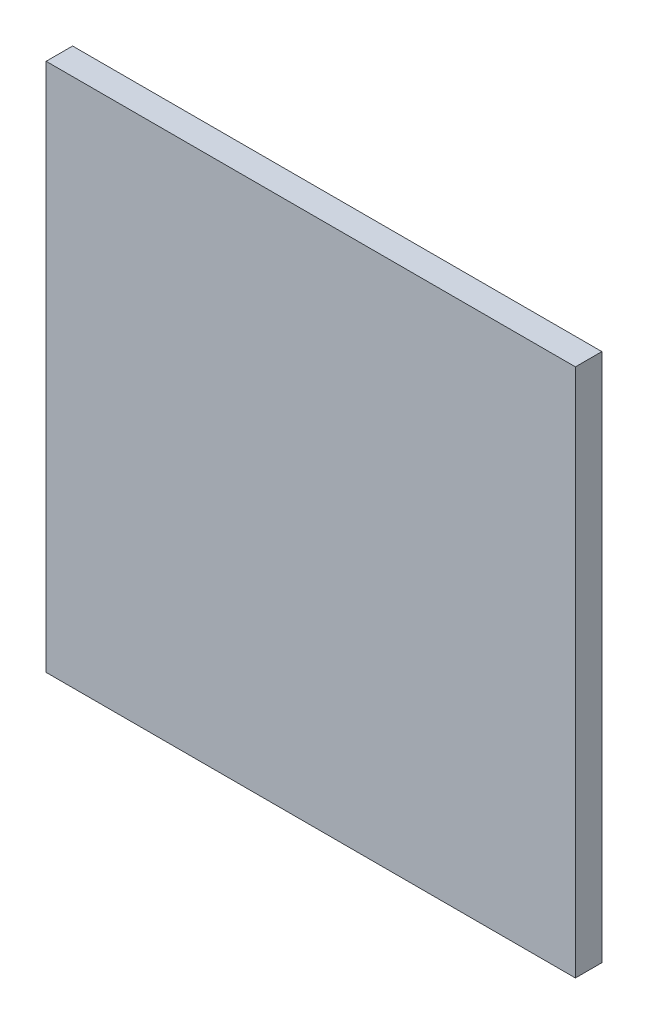
ISO-10303-21;
HEADER;
FILE_DESCRIPTION(('STEP AP214'),'2;1');
FILE_NAME('part.step','',(''),(''),'','','');
FILE_SCHEMA(('AUTOMOTIVE_DESIGN { 1 0 10303 214 1 1 1 1 }'));
ENDSEC;
DATA;
#1=APPLICATION_CONTEXT('core data for automotive mechanical design processes');
#2=APPLICATION_PROTOCOL_DEFINITION('international standard','automotive_design',2000,#1);
#3=PRODUCT_CONTEXT('',#1,'mechanical');
#4=PRODUCT('Part','Part','',(#3));
#5=PRODUCT_RELATED_PRODUCT_CATEGORY('part','',(#4));
#6=PRODUCT_DEFINITION_FORMATION('','',#4);
#7=PRODUCT_DEFINITION_CONTEXT('part definition',#1,'design');
#8=PRODUCT_DEFINITION('design','',#6,#7);
#9=PRODUCT_DEFINITION_SHAPE('','',#8);
#10=(LENGTH_UNIT() NAMED_UNIT(*) SI_UNIT(.MILLI.,.METRE.));
#11=(NAMED_UNIT(*) PLANE_ANGLE_UNIT() SI_UNIT($,.RADIAN.));
#12=(NAMED_UNIT(*) SI_UNIT($,.STERADIAN.) SOLID_ANGLE_UNIT());
#13=UNCERTAINTY_MEASURE_WITH_UNIT(LENGTH_MEASURE(1.E-05),#10,'distance_accuracy_value','');
#14=(GEOMETRIC_REPRESENTATION_CONTEXT(3) GLOBAL_UNCERTAINTY_ASSIGNED_CONTEXT((#13)) GLOBAL_UNIT_ASSIGNED_CONTEXT((#10,
#11,#12)) REPRESENTATION_CONTEXT('',''));
#15=CARTESIAN_POINT('',(0.,0.,0.));
#16=DIRECTION('',(0.,0.,1.));
#17=DIRECTION('',(1.,0.,0.));
#18=AXIS2_PLACEMENT_3D('',#15,#16,#17);
#19=CARTESIAN_POINT('',(0.,0.,-25.4));
#20=DIRECTION('',(-1.,0.,0.));
#21=DIRECTION('',(0.,0.,1.));
#22=AXIS2_PLACEMENT_3D('',#19,#20,#21);
#23=PLANE('',#22);
#24=DIRECTION('',(0.,-1.,0.));
#25=VECTOR('',#24,1.);
#26=CARTESIAN_POINT('',(0.,0.,0.));
#27=LINE('',#26,#25);
#28=CARTESIAN_POINT('',(0.,508.,0.));
#29=VERTEX_POINT('',#28);
#30=CARTESIAN_POINT('',(0.,0.,0.));
#31=VERTEX_POINT('',#30);
#32=EDGE_CURVE('E80',#29,#31,#27,.T.);
#33=ORIENTED_EDGE('',*,*,#32,.F.);
#34=DIRECTION('',(0.,0.,1.));
#35=VECTOR('',#34,1.);
#36=CARTESIAN_POINT('',(0.,508.,-25.4));
#37=LINE('',#36,#35);
#38=CARTESIAN_POINT('',(0.,508.,-25.4));
#39=VERTEX_POINT('',#38);
#40=EDGE_CURVE('E11',#39,#29,#37,.T.);
#41=ORIENTED_EDGE('',*,*,#40,.F.);
#42=DIRECTION('',(0.,-1.,0.));
#43=VECTOR('',#42,1.);
#44=CARTESIAN_POINT('',(0.,0.,-25.4));
#45=LINE('',#44,#43);
#46=CARTESIAN_POINT('',(0.,0.,-25.4));
#47=VERTEX_POINT('',#46);
#48=EDGE_CURVE('E82',#39,#47,#45,.T.);
#49=ORIENTED_EDGE('',*,*,#48,.T.);
#50=DIRECTION('',(0.,0.,1.));
#51=VECTOR('',#50,1.);
#52=CARTESIAN_POINT('',(0.,0.,-25.4));
#53=LINE('',#52,#51);
#54=EDGE_CURVE('E43',#47,#31,#53,.T.);
#55=ORIENTED_EDGE('',*,*,#54,.T.);
#56=EDGE_LOOP('',(#33,#41,#49,#55));
#57=FACE_BOUND('',#56,.T.);
#58=ADVANCED_FACE('F40',(#57),#23,.T.);
#59=CARTESIAN_POINT('',(0.,508.,-25.4));
#60=DIRECTION('',(0.,1.,0.));
#61=DIRECTION('',(0.,0.,1.));
#62=AXIS2_PLACEMENT_3D('',#59,#60,#61);
#63=PLANE('',#62);
#64=DIRECTION('',(-1.,0.,0.));
#65=VECTOR('',#64,1.);
#66=CARTESIAN_POINT('',(0.,508.,0.));
#67=LINE('',#66,#65);
#68=CARTESIAN_POINT('',(508.,508.,0.));
#69=VERTEX_POINT('',#68);
#70=EDGE_CURVE('E97',#69,#29,#67,.T.);
#71=ORIENTED_EDGE('',*,*,#70,.F.);
#72=DIRECTION('',(0.,0.,1.));
#73=VECTOR('',#72,1.);
#74=CARTESIAN_POINT('',(508.,508.,-25.4));
#75=LINE('',#74,#73);
#76=CARTESIAN_POINT('',(508.,508.,-25.4));
#77=VERTEX_POINT('',#76);
#78=EDGE_CURVE('E48',#77,#69,#75,.T.);
#79=ORIENTED_EDGE('',*,*,#78,.F.);
#80=DIRECTION('',(-1.,0.,0.));
#81=VECTOR('',#80,1.);
#82=CARTESIAN_POINT('',(0.,508.,-25.4));
#83=LINE('',#82,#81);
#84=EDGE_CURVE('E87',#77,#39,#83,.T.);
#85=ORIENTED_EDGE('',*,*,#84,.T.);
#86=ORIENTED_EDGE('',*,*,#40,.T.);
#87=EDGE_LOOP('',(#71,#79,#85,#86));
#88=FACE_BOUND('',#87,.T.);
#89=ADVANCED_FACE('F112',(#88),#63,.T.);
#90=CARTESIAN_POINT('',(508.,0.,-25.4));
#91=DIRECTION('',(1.,0.,0.));
#92=DIRECTION('',(0.,0.,-1.));
#93=AXIS2_PLACEMENT_3D('',#90,#91,#92);
#94=PLANE('',#93);
#95=DIRECTION('',(0.,1.,0.));
#96=VECTOR('',#95,1.);
#97=CARTESIAN_POINT('',(508.,0.,0.));
#98=LINE('',#97,#96);
#99=CARTESIAN_POINT('',(508.,0.,0.));
#100=VERTEX_POINT('',#99);
#101=EDGE_CURVE('E94',#100,#69,#98,.T.);
#102=ORIENTED_EDGE('',*,*,#101,.F.);
#103=DIRECTION('',(0.,0.,1.));
#104=VECTOR('',#103,1.);
#105=CARTESIAN_POINT('',(508.,0.,-25.4));
#106=LINE('',#105,#104);
#107=CARTESIAN_POINT('',(508.,0.,-25.4));
#108=VERTEX_POINT('',#107);
#109=EDGE_CURVE('E86',#108,#100,#106,.T.);
#110=ORIENTED_EDGE('',*,*,#109,.F.);
#111=DIRECTION('',(0.,1.,0.));
#112=VECTOR('',#111,1.);
#113=CARTESIAN_POINT('',(508.,0.,-25.4));
#114=LINE('',#113,#112);
#115=EDGE_CURVE('E105',#108,#77,#114,.T.);
#116=ORIENTED_EDGE('',*,*,#115,.T.);
#117=ORIENTED_EDGE('',*,*,#78,.T.);
#118=EDGE_LOOP('',(#102,#110,#116,#117));
#119=FACE_BOUND('',#118,.T.);
#120=ADVANCED_FACE('F109',(#119),#94,.T.);
#121=CARTESIAN_POINT('',(0.,0.,-25.4));
#122=DIRECTION('',(0.,-1.,0.));
#123=DIRECTION('',(0.,0.,-1.));
#124=AXIS2_PLACEMENT_3D('',#121,#122,#123);
#125=PLANE('',#124);
#126=DIRECTION('',(1.,0.,0.));
#127=VECTOR('',#126,1.);
#128=CARTESIAN_POINT('',(0.,0.,0.));
#129=LINE('',#128,#127);
#130=EDGE_CURVE('E89',#31,#100,#129,.T.);
#131=ORIENTED_EDGE('',*,*,#130,.F.);
#132=ORIENTED_EDGE('',*,*,#54,.F.);
#133=DIRECTION('',(1.,0.,0.));
#134=VECTOR('',#133,1.);
#135=CARTESIAN_POINT('',(0.,0.,-25.4));
#136=LINE('',#135,#134);
#137=EDGE_CURVE('E103',#47,#108,#136,.T.);
#138=ORIENTED_EDGE('',*,*,#137,.T.);
#139=ORIENTED_EDGE('',*,*,#109,.T.);
#140=EDGE_LOOP('',(#131,#132,#138,#139));
#141=FACE_BOUND('',#140,.T.);
#142=ADVANCED_FACE('F90',(#141),#125,.T.);
#143=CARTESIAN_POINT('',(0.,508.,-25.4));
#144=DIRECTION('',(0.,0.,-1.));
#145=DIRECTION('',(-1.,0.,0.));
#146=AXIS2_PLACEMENT_3D('',#143,#144,#145);
#147=PLANE('',#146);
#148=ORIENTED_EDGE('',*,*,#48,.F.);
#149=ORIENTED_EDGE('',*,*,#84,.F.);
#150=ORIENTED_EDGE('',*,*,#115,.F.);
#151=ORIENTED_EDGE('',*,*,#137,.F.);
#152=EDGE_LOOP('',(#148,#149,#150,#151));
#153=FACE_BOUND('',#152,.T.);
#154=ADVANCED_FACE('F114',(#153),#147,.T.);
#155=CARTESIAN_POINT('',(0.,508.,0.));
#156=DIRECTION('',(0.,0.,-1.));
#157=DIRECTION('',(-1.,0.,0.));
#158=AXIS2_PLACEMENT_3D('',#155,#156,#157);
#159=PLANE('',#158);
#160=ORIENTED_EDGE('',*,*,#32,.T.);
#161=ORIENTED_EDGE('',*,*,#130,.T.);
#162=ORIENTED_EDGE('',*,*,#101,.T.);
#163=ORIENTED_EDGE('',*,*,#70,.T.);
#164=EDGE_LOOP('',(#160,#161,#162,#163));
#165=FACE_BOUND('',#164,.T.);
#166=ADVANCED_FACE('F96',(#165),#159,.F.);
#167=CLOSED_SHELL('',(#58,#89,#120,#142,#154,#166));
#168=MANIFOLD_SOLID_BREP('B2',#167);
#169=ADVANCED_BREP_SHAPE_REPRESENTATION('',(#18,#168),#14);
#170=SHAPE_DEFINITION_REPRESENTATION(#9,#169);
ENDSEC;
END-ISO-10303-21;
